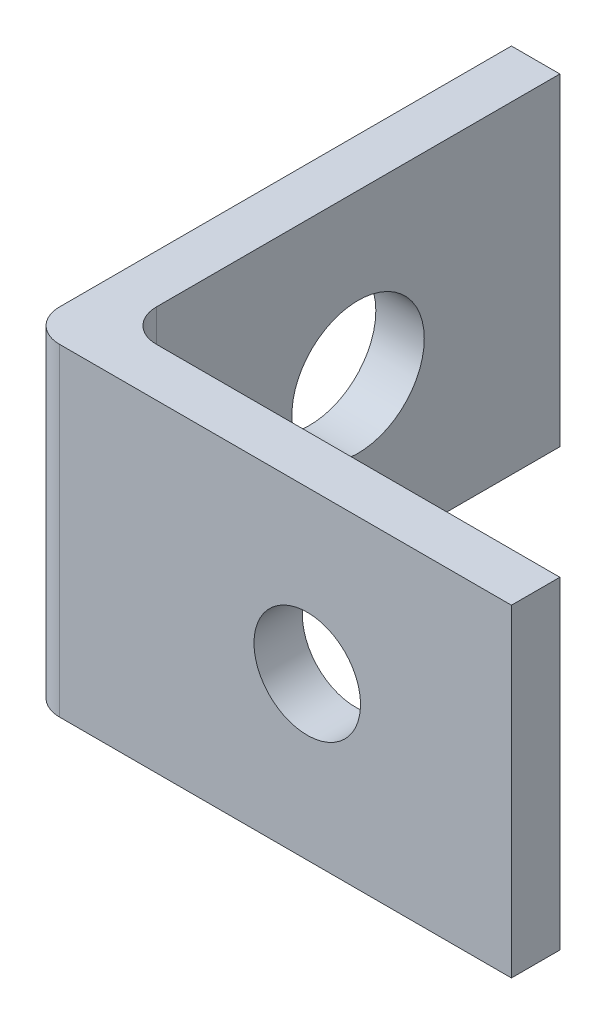
ISO-10303-21;
HEADER;
FILE_DESCRIPTION(('STEP AP214'),'2;1');
FILE_NAME('part.step','',(''),(''),'','','');
FILE_SCHEMA(('AUTOMOTIVE_DESIGN { 1 0 10303 214 1 1 1 1 }'));
ENDSEC;
DATA;
#1=APPLICATION_CONTEXT('core data for automotive mechanical design processes');
#2=APPLICATION_PROTOCOL_DEFINITION('international standard','automotive_design',2000,#1);
#3=PRODUCT_CONTEXT('',#1,'mechanical');
#4=PRODUCT('Part','Part','',(#3));
#5=PRODUCT_RELATED_PRODUCT_CATEGORY('part','',(#4));
#6=PRODUCT_DEFINITION_FORMATION('','',#4);
#7=PRODUCT_DEFINITION_CONTEXT('part definition',#1,'design');
#8=PRODUCT_DEFINITION('design','',#6,#7);
#9=PRODUCT_DEFINITION_SHAPE('','',#8);
#10=(LENGTH_UNIT() NAMED_UNIT(*) SI_UNIT(.MILLI.,.METRE.));
#11=(NAMED_UNIT(*) PLANE_ANGLE_UNIT() SI_UNIT($,.RADIAN.));
#12=(NAMED_UNIT(*) SI_UNIT($,.STERADIAN.) SOLID_ANGLE_UNIT());
#13=UNCERTAINTY_MEASURE_WITH_UNIT(LENGTH_MEASURE(1.E-05),#10,'distance_accuracy_value','');
#14=(GEOMETRIC_REPRESENTATION_CONTEXT(3) GLOBAL_UNCERTAINTY_ASSIGNED_CONTEXT((#13)) GLOBAL_UNIT_ASSIGNED_CONTEXT((#10,
#11,#12)) REPRESENTATION_CONTEXT('',''));
#15=CARTESIAN_POINT('',(0.,0.,0.));
#16=DIRECTION('',(0.,0.,1.));
#17=DIRECTION('',(1.,0.,0.));
#18=AXIS2_PLACEMENT_3D('',#15,#16,#17);
#19=CARTESIAN_POINT('',(0.,10.,-15.));
#20=DIRECTION('',(0.,0.,1.));
#21=DIRECTION('',(1.,0.,0.));
#22=AXIS2_PLACEMENT_3D('',#19,#20,#21);
#23=PLANE('',#22);
#24=DIRECTION('',(-1.,0.,0.));
#25=VECTOR('',#24,1.);
#26=CARTESIAN_POINT('',(0.,0.,-15.));
#27=LINE('',#26,#25);
#28=CARTESIAN_POINT('',(1.5,0.,-15.));
#29=VERTEX_POINT('',#28);
#30=CARTESIAN_POINT('',(0.,0.,-15.));
#31=VERTEX_POINT('',#30);
#32=EDGE_CURVE('E131',#29,#31,#27,.T.);
#33=ORIENTED_EDGE('',*,*,#32,.T.);
#34=DIRECTION('',(0.,-1.,0.));
#35=VECTOR('',#34,1.);
#36=CARTESIAN_POINT('',(0.,10.,-15.));
#37=LINE('',#36,#35);
#38=CARTESIAN_POINT('',(0.,10.,-15.));
#39=VERTEX_POINT('',#38);
#40=EDGE_CURVE('E11',#39,#31,#37,.T.);
#41=ORIENTED_EDGE('',*,*,#40,.F.);
#42=DIRECTION('',(-1.,0.,0.));
#43=VECTOR('',#42,1.);
#44=CARTESIAN_POINT('',(0.,10.,-15.));
#45=LINE('',#44,#43);
#46=CARTESIAN_POINT('',(1.5,10.,-15.));
#47=VERTEX_POINT('',#46);
#48=EDGE_CURVE('E146',#47,#39,#45,.T.);
#49=ORIENTED_EDGE('',*,*,#48,.F.);
#50=DIRECTION('',(0.,-1.,0.));
#51=VECTOR('',#50,1.);
#52=CARTESIAN_POINT('',(1.5,10.,-15.));
#53=LINE('',#52,#51);
#54=EDGE_CURVE('E127',#47,#29,#53,.T.);
#55=ORIENTED_EDGE('',*,*,#54,.T.);
#56=EDGE_LOOP('',(#33,#41,#49,#55));
#57=FACE_BOUND('',#56,.T.);
#58=ADVANCED_FACE('F35',(#57),#23,.F.);
#59=CARTESIAN_POINT('',(0.,10.,-1.00000000000001));
#60=DIRECTION('',(1.,0.,0.));
#61=DIRECTION('',(0.,0.,-1.));
#62=AXIS2_PLACEMENT_3D('',#59,#60,#61);
#63=PLANE('',#62);
#64=CARTESIAN_POINT('',(0.,5.,-8.75));
#65=DIRECTION('',(1.,0.,0.));
#66=DIRECTION('',(0.,0.,-1.));
#67=AXIS2_PLACEMENT_3D('',#64,#65,#66);
#68=CIRCLE('',#67,2.05);
#69=CARTESIAN_POINT('',(0.,5.,-10.8));
#70=VERTEX_POINT('',#69);
#71=EDGE_CURVE('E184',#70,#70,#68,.T.);
#72=ORIENTED_EDGE('',*,*,#71,.T.);
#73=EDGE_LOOP('',(#72));
#74=FACE_BOUND('',#73,.T.);
#75=DIRECTION('',(0.,0.,1.));
#76=VECTOR('',#75,1.);
#77=CARTESIAN_POINT('',(0.,0.,-1.00000000000001));
#78=LINE('',#77,#76);
#79=CARTESIAN_POINT('',(0.,0.,-1.00000000000001));
#80=VERTEX_POINT('',#79);
#81=EDGE_CURVE('E134',#31,#80,#78,.T.);
#82=ORIENTED_EDGE('',*,*,#81,.T.);
#83=DIRECTION('',(0.,-1.,0.));
#84=VECTOR('',#83,1.);
#85=CARTESIAN_POINT('',(0.,10.,-1.00000000000001));
#86=LINE('',#85,#84);
#87=CARTESIAN_POINT('',(0.,10.,-1.00000000000001));
#88=VERTEX_POINT('',#87);
#89=EDGE_CURVE('E43',#88,#80,#86,.T.);
#90=ORIENTED_EDGE('',*,*,#89,.F.);
#91=DIRECTION('',(0.,0.,1.));
#92=VECTOR('',#91,1.);
#93=CARTESIAN_POINT('',(0.,10.,-1.00000000000001));
#94=LINE('',#93,#92);
#95=EDGE_CURVE('E94',#39,#88,#94,.T.);
#96=ORIENTED_EDGE('',*,*,#95,.F.);
#97=ORIENTED_EDGE('',*,*,#40,.T.);
#98=EDGE_LOOP('',(#82,#90,#96,#97));
#99=FACE_BOUND('',#98,.T.);
#100=ADVANCED_FACE('F205',(#74,#99),#63,.F.);
#101=CARTESIAN_POINT('',(1.,10.,-1.));
#102=DIRECTION('',(0.,-1.,0.));
#103=DIRECTION('',(0.,0.,-1.));
#104=AXIS2_PLACEMENT_3D('',#101,#102,#103);
#105=CYLINDRICAL_SURFACE('',#104,1.);
#106=CARTESIAN_POINT('',(1.,0.,-1.));
#107=DIRECTION('',(0.,1.,0.));
#108=DIRECTION('',(0.,0.,-1.));
#109=AXIS2_PLACEMENT_3D('',#106,#107,#108);
#110=CIRCLE('',#109,1.);
#111=CARTESIAN_POINT('',(1.00000000000001,0.,0.));
#112=VERTEX_POINT('',#111);
#113=EDGE_CURVE('E137',#80,#112,#110,.T.);
#114=ORIENTED_EDGE('',*,*,#113,.T.);
#115=DIRECTION('',(0.,-1.,0.));
#116=VECTOR('',#115,1.);
#117=CARTESIAN_POINT('',(1.00000000000001,10.,0.));
#118=LINE('',#117,#116);
#119=CARTESIAN_POINT('',(1.00000000000001,10.,0.));
#120=VERTEX_POINT('',#119);
#121=EDGE_CURVE('E153',#120,#112,#118,.T.);
#122=ORIENTED_EDGE('',*,*,#121,.F.);
#123=CARTESIAN_POINT('',(1.,10.,-1.));
#124=DIRECTION('',(0.,1.,0.));
#125=DIRECTION('',(0.,0.,-1.));
#126=AXIS2_PLACEMENT_3D('',#123,#124,#125);
#127=CIRCLE('',#126,1.);
#128=EDGE_CURVE('E161',#88,#120,#127,.T.);
#129=ORIENTED_EDGE('',*,*,#128,.F.);
#130=ORIENTED_EDGE('',*,*,#89,.T.);
#131=EDGE_LOOP('',(#114,#122,#129,#130));
#132=FACE_BOUND('',#131,.T.);
#133=ADVANCED_FACE('F159',(#132),#105,.T.);
#134=CARTESIAN_POINT('',(1.00000000000001,10.,0.));
#135=DIRECTION('',(0.,0.,-1.));
#136=DIRECTION('',(-1.,0.,0.));
#137=AXIS2_PLACEMENT_3D('',#134,#135,#136);
#138=PLANE('',#137);
#139=CARTESIAN_POINT('',(8.67557155144477,5.00000000000067,0.));
#140=DIRECTION('',(0.,0.,-1.));
#141=DIRECTION('',(-1.,0.,0.));
#142=AXIS2_PLACEMENT_3D('',#139,#140,#141);
#143=CIRCLE('',#142,1.64999999999994);
#144=CARTESIAN_POINT('',(7.02557155144484,5.00000000000067,0.));
#145=VERTEX_POINT('',#144);
#146=EDGE_CURVE('E135',#145,#145,#143,.T.);
#147=ORIENTED_EDGE('',*,*,#146,.T.);
#148=EDGE_LOOP('',(#147));
#149=FACE_BOUND('',#148,.T.);
#150=DIRECTION('',(1.,0.,0.));
#151=VECTOR('',#150,1.);
#152=CARTESIAN_POINT('',(1.00000000000001,0.,0.));
#153=LINE('',#152,#151);
#154=CARTESIAN_POINT('',(15.,0.,0.));
#155=VERTEX_POINT('',#154);
#156=EDGE_CURVE('E139',#112,#155,#153,.T.);
#157=ORIENTED_EDGE('',*,*,#156,.T.);
#158=DIRECTION('',(0.,-1.,0.));
#159=VECTOR('',#158,1.);
#160=CARTESIAN_POINT('',(15.,10.,0.));
#161=LINE('',#160,#159);
#162=CARTESIAN_POINT('',(15.,10.,0.));
#163=VERTEX_POINT('',#162);
#164=EDGE_CURVE('E150',#163,#155,#161,.T.);
#165=ORIENTED_EDGE('',*,*,#164,.F.);
#166=DIRECTION('',(1.,0.,0.));
#167=VECTOR('',#166,1.);
#168=CARTESIAN_POINT('',(1.00000000000001,10.,0.));
#169=LINE('',#168,#167);
#170=EDGE_CURVE('E173',#120,#163,#169,.T.);
#171=ORIENTED_EDGE('',*,*,#170,.F.);
#172=ORIENTED_EDGE('',*,*,#121,.T.);
#173=EDGE_LOOP('',(#157,#165,#171,#172));
#174=FACE_BOUND('',#173,.T.);
#175=ADVANCED_FACE('F169',(#149,#174),#138,.F.);
#176=CARTESIAN_POINT('',(15.,10.,0.));
#177=DIRECTION('',(-1.,0.,0.));
#178=DIRECTION('',(0.,0.,1.));
#179=AXIS2_PLACEMENT_3D('',#176,#177,#178);
#180=PLANE('',#179);
#181=DIRECTION('',(0.,0.,-1.));
#182=VECTOR('',#181,1.);
#183=CARTESIAN_POINT('',(15.,0.,0.));
#184=LINE('',#183,#182);
#185=CARTESIAN_POINT('',(15.,0.,-1.5));
#186=VERTEX_POINT('',#185);
#187=EDGE_CURVE('E141',#155,#186,#184,.T.);
#188=ORIENTED_EDGE('',*,*,#187,.T.);
#189=DIRECTION('',(0.,-1.,0.));
#190=VECTOR('',#189,1.);
#191=CARTESIAN_POINT('',(15.,10.,-1.5));
#192=LINE('',#191,#190);
#193=CARTESIAN_POINT('',(15.,10.,-1.5));
#194=VERTEX_POINT('',#193);
#195=EDGE_CURVE('E122',#194,#186,#192,.T.);
#196=ORIENTED_EDGE('',*,*,#195,.F.);
#197=DIRECTION('',(0.,0.,-1.));
#198=VECTOR('',#197,1.);
#199=CARTESIAN_POINT('',(15.,10.,0.));
#200=LINE('',#199,#198);
#201=EDGE_CURVE('E113',#163,#194,#200,.T.);
#202=ORIENTED_EDGE('',*,*,#201,.F.);
#203=ORIENTED_EDGE('',*,*,#164,.T.);
#204=EDGE_LOOP('',(#188,#196,#202,#203));
#205=FACE_BOUND('',#204,.T.);
#206=ADVANCED_FACE('F172',(#205),#180,.F.);
#207=CARTESIAN_POINT('',(15.,10.,-1.5));
#208=DIRECTION('',(0.,0.,1.));
#209=DIRECTION('',(1.,0.,0.));
#210=AXIS2_PLACEMENT_3D('',#207,#208,#209);
#211=PLANE('',#210);
#212=CARTESIAN_POINT('',(8.67557155144477,5.00000000000067,-1.49999999999994));
#213=DIRECTION('',(0.,0.,-1.));
#214=DIRECTION('',(-1.,0.,0.));
#215=AXIS2_PLACEMENT_3D('',#212,#213,#214);
#216=CIRCLE('',#215,1.64999999999994);
#217=CARTESIAN_POINT('',(7.02557155144484,5.00000000000067,-1.49999999999994));
#218=VERTEX_POINT('',#217);
#219=EDGE_CURVE('E181',#218,#218,#216,.T.);
#220=ORIENTED_EDGE('',*,*,#219,.F.);
#221=EDGE_LOOP('',(#220));
#222=FACE_BOUND('',#221,.T.);
#223=DIRECTION('',(-1.,0.,0.));
#224=VECTOR('',#223,1.);
#225=CARTESIAN_POINT('',(15.,0.,-1.5));
#226=LINE('',#225,#224);
#227=CARTESIAN_POINT('',(2.50000000000001,0.,-1.5));
#228=VERTEX_POINT('',#227);
#229=EDGE_CURVE('E121',#186,#228,#226,.T.);
#230=ORIENTED_EDGE('',*,*,#229,.T.);
#231=DIRECTION('',(0.,-1.,0.));
#232=VECTOR('',#231,1.);
#233=CARTESIAN_POINT('',(2.50000000000001,10.,-1.5));
#234=LINE('',#233,#232);
#235=CARTESIAN_POINT('',(2.50000000000001,10.,-1.5));
#236=VERTEX_POINT('',#235);
#237=EDGE_CURVE('E118',#236,#228,#234,.T.);
#238=ORIENTED_EDGE('',*,*,#237,.F.);
#239=DIRECTION('',(-1.,0.,0.));
#240=VECTOR('',#239,1.);
#241=CARTESIAN_POINT('',(15.,10.,-1.5));
#242=LINE('',#241,#240);
#243=EDGE_CURVE('E107',#194,#236,#242,.T.);
#244=ORIENTED_EDGE('',*,*,#243,.F.);
#245=ORIENTED_EDGE('',*,*,#195,.T.);
#246=EDGE_LOOP('',(#230,#238,#244,#245));
#247=FACE_BOUND('',#246,.T.);
#248=ADVANCED_FACE('F119',(#222,#247),#211,.F.);
#249=CARTESIAN_POINT('',(2.5,10.,-2.5));
#250=DIRECTION('',(0.,-1.,0.));
#251=DIRECTION('',(0.,0.,-1.));
#252=AXIS2_PLACEMENT_3D('',#249,#250,#251);
#253=CYLINDRICAL_SURFACE('',#252,1.);
#254=CARTESIAN_POINT('',(2.5,0.,-2.5));
#255=DIRECTION('',(0.,-1.,0.));
#256=DIRECTION('',(0.,0.,-1.));
#257=AXIS2_PLACEMENT_3D('',#254,#255,#256);
#258=CIRCLE('',#257,1.);
#259=CARTESIAN_POINT('',(1.5,0.,-2.50000000000001));
#260=VERTEX_POINT('',#259);
#261=EDGE_CURVE('E80',#228,#260,#258,.T.);
#262=ORIENTED_EDGE('',*,*,#261,.T.);
#263=DIRECTION('',(0.,-1.,0.));
#264=VECTOR('',#263,1.);
#265=CARTESIAN_POINT('',(1.5,10.,-2.50000000000001));
#266=LINE('',#265,#264);
#267=CARTESIAN_POINT('',(1.5,10.,-2.50000000000001));
#268=VERTEX_POINT('',#267);
#269=EDGE_CURVE('E123',#268,#260,#266,.T.);
#270=ORIENTED_EDGE('',*,*,#269,.F.);
#271=CARTESIAN_POINT('',(2.5,10.,-2.5));
#272=DIRECTION('',(0.,-1.,0.));
#273=DIRECTION('',(0.,0.,-1.));
#274=AXIS2_PLACEMENT_3D('',#271,#272,#273);
#275=CIRCLE('',#274,1.);
#276=EDGE_CURVE('E111',#236,#268,#275,.T.);
#277=ORIENTED_EDGE('',*,*,#276,.F.);
#278=ORIENTED_EDGE('',*,*,#237,.T.);
#279=EDGE_LOOP('',(#262,#270,#277,#278));
#280=FACE_BOUND('',#279,.T.);
#281=ADVANCED_FACE('F125',(#280),#253,.F.);
#282=CARTESIAN_POINT('',(1.5,10.,-2.50000000000001));
#283=DIRECTION('',(-1.,0.,0.));
#284=DIRECTION('',(0.,0.,1.));
#285=AXIS2_PLACEMENT_3D('',#282,#283,#284);
#286=PLANE('',#285);
#287=CARTESIAN_POINT('',(1.5,5.,-8.75));
#288=DIRECTION('',(1.,0.,0.));
#289=DIRECTION('',(0.,0.,-1.));
#290=AXIS2_PLACEMENT_3D('',#287,#288,#289);
#291=CIRCLE('',#290,2.05);
#292=CARTESIAN_POINT('',(1.5,5.,-10.8));
#293=VERTEX_POINT('',#292);
#294=EDGE_CURVE('E187',#293,#293,#291,.T.);
#295=ORIENTED_EDGE('',*,*,#294,.F.);
#296=EDGE_LOOP('',(#295));
#297=FACE_BOUND('',#296,.T.);
#298=DIRECTION('',(0.,0.,-1.));
#299=VECTOR('',#298,1.);
#300=CARTESIAN_POINT('',(1.5,0.,-2.50000000000001));
#301=LINE('',#300,#299);
#302=EDGE_CURVE('E86',#260,#29,#301,.T.);
#303=ORIENTED_EDGE('',*,*,#302,.T.);
#304=ORIENTED_EDGE('',*,*,#54,.F.);
#305=DIRECTION('',(0.,0.,-1.));
#306=VECTOR('',#305,1.);
#307=CARTESIAN_POINT('',(1.5,10.,-2.50000000000001));
#308=LINE('',#307,#306);
#309=EDGE_CURVE('E51',#268,#47,#308,.T.);
#310=ORIENTED_EDGE('',*,*,#309,.F.);
#311=ORIENTED_EDGE('',*,*,#269,.T.);
#312=EDGE_LOOP('',(#303,#304,#310,#311));
#313=FACE_BOUND('',#312,.T.);
#314=ADVANCED_FACE('F194',(#297,#313),#286,.F.);
#315=CARTESIAN_POINT('',(2.5,10.,-2.5));
#316=DIRECTION('',(0.,-1.,0.));
#317=DIRECTION('',(0.,0.,-1.));
#318=AXIS2_PLACEMENT_3D('',#315,#316,#317);
#319=PLANE('',#318);
#320=ORIENTED_EDGE('',*,*,#48,.T.);
#321=ORIENTED_EDGE('',*,*,#95,.T.);
#322=ORIENTED_EDGE('',*,*,#128,.T.);
#323=ORIENTED_EDGE('',*,*,#170,.T.);
#324=ORIENTED_EDGE('',*,*,#201,.T.);
#325=ORIENTED_EDGE('',*,*,#243,.T.);
#326=ORIENTED_EDGE('',*,*,#276,.T.);
#327=ORIENTED_EDGE('',*,*,#309,.T.);
#328=EDGE_LOOP('',(#320,#321,#322,#323,#324,#325,#326,#327));
#329=FACE_BOUND('',#328,.T.);
#330=ADVANCED_FACE('F109',(#329),#319,.F.);
#331=CARTESIAN_POINT('',(2.5,0.,-2.5));
#332=DIRECTION('',(0.,-1.,0.));
#333=DIRECTION('',(0.,0.,-1.));
#334=AXIS2_PLACEMENT_3D('',#331,#332,#333);
#335=PLANE('',#334);
#336=ORIENTED_EDGE('',*,*,#32,.F.);
#337=ORIENTED_EDGE('',*,*,#302,.F.);
#338=ORIENTED_EDGE('',*,*,#261,.F.);
#339=ORIENTED_EDGE('',*,*,#229,.F.);
#340=ORIENTED_EDGE('',*,*,#187,.F.);
#341=ORIENTED_EDGE('',*,*,#156,.F.);
#342=ORIENTED_EDGE('',*,*,#113,.F.);
#343=ORIENTED_EDGE('',*,*,#81,.F.);
#344=EDGE_LOOP('',(#336,#337,#338,#339,#340,#341,#342,#343));
#345=FACE_BOUND('',#344,.T.);
#346=ADVANCED_FACE('F165',(#345),#335,.T.);
#347=CARTESIAN_POINT('',(8.67557155144477,5.00000000000067,6.50000000000006));
#348=DIRECTION('',(0.,0.,-1.));
#349=DIRECTION('',(-1.,0.,0.));
#350=AXIS2_PLACEMENT_3D('',#347,#348,#349);
#351=CYLINDRICAL_SURFACE('',#350,1.64999999999994);
#352=ORIENTED_EDGE('',*,*,#219,.T.);
#353=EDGE_LOOP('',(#352));
#354=FACE_BOUND('',#353,.T.);
#355=ORIENTED_EDGE('',*,*,#146,.F.);
#356=EDGE_LOOP('',(#355));
#357=FACE_BOUND('',#356,.T.);
#358=ADVANCED_FACE('F229',(#354,#357),#351,.F.);
#359=CARTESIAN_POINT('',(-93.5,5.,-8.75));
#360=DIRECTION('',(1.,0.,0.));
#361=DIRECTION('',(0.,0.,-1.));
#362=AXIS2_PLACEMENT_3D('',#359,#360,#361);
#363=CYLINDRICAL_SURFACE('',#362,2.05);
#364=ORIENTED_EDGE('',*,*,#294,.T.);
#365=EDGE_LOOP('',(#364));
#366=FACE_BOUND('',#365,.T.);
#367=ORIENTED_EDGE('',*,*,#71,.F.);
#368=EDGE_LOOP('',(#367));
#369=FACE_BOUND('',#368,.T.);
#370=ADVANCED_FACE('F191',(#366,#369),#363,.F.);
#371=CLOSED_SHELL('',(#58,#100,#133,#175,#206,#248,#281,#314,#330,#346,#358,#370));
#372=MANIFOLD_SOLID_BREP('B2',#371);
#373=ADVANCED_BREP_SHAPE_REPRESENTATION('',(#18,#372),#14);
#374=SHAPE_DEFINITION_REPRESENTATION(#9,#373);
ENDSEC;
END-ISO-10303-21;
